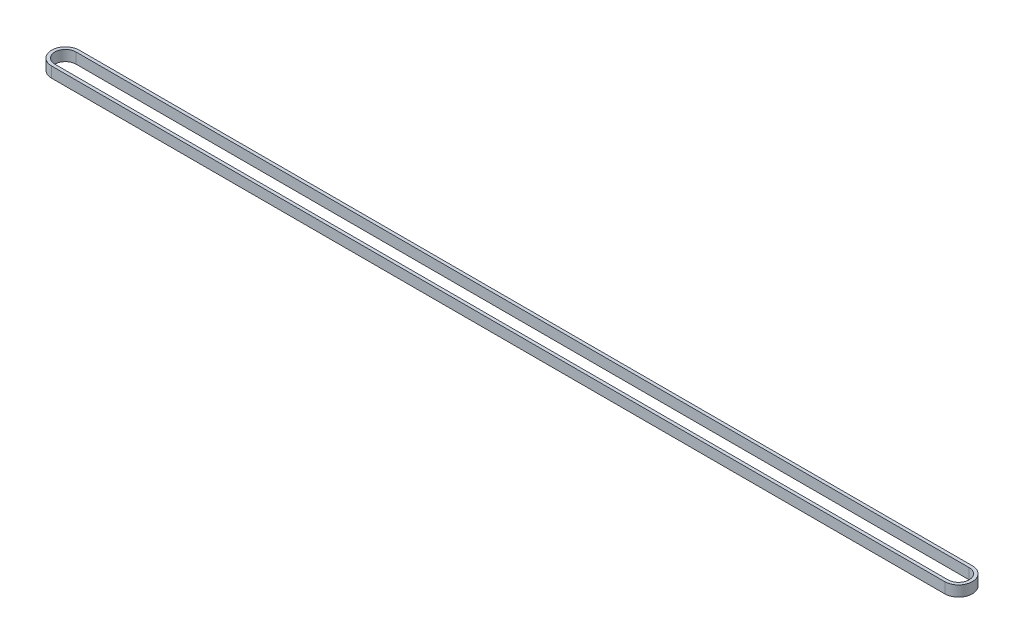
ISO-10303-21;
HEADER;
FILE_DESCRIPTION(('STEP AP214'),'2;1');
FILE_NAME('part.step','',(''),(''),'','','');
FILE_SCHEMA(('AUTOMOTIVE_DESIGN { 1 0 10303 214 1 1 1 1 }'));
ENDSEC;
DATA;
#1=APPLICATION_CONTEXT('core data for automotive mechanical design processes');
#2=APPLICATION_PROTOCOL_DEFINITION('international standard','automotive_design',2000,#1);
#3=PRODUCT_CONTEXT('',#1,'mechanical');
#4=PRODUCT('Part','Part','',(#3));
#5=PRODUCT_RELATED_PRODUCT_CATEGORY('part','',(#4));
#6=PRODUCT_DEFINITION_FORMATION('','',#4);
#7=PRODUCT_DEFINITION_CONTEXT('part definition',#1,'design');
#8=PRODUCT_DEFINITION('design','',#6,#7);
#9=PRODUCT_DEFINITION_SHAPE('','',#8);
#10=(LENGTH_UNIT() NAMED_UNIT(*) SI_UNIT(.MILLI.,.METRE.));
#11=(NAMED_UNIT(*) PLANE_ANGLE_UNIT() SI_UNIT($,.RADIAN.));
#12=(NAMED_UNIT(*) SI_UNIT($,.STERADIAN.) SOLID_ANGLE_UNIT());
#13=UNCERTAINTY_MEASURE_WITH_UNIT(LENGTH_MEASURE(1.E-05),#10,'distance_accuracy_value','');
#14=(GEOMETRIC_REPRESENTATION_CONTEXT(3) GLOBAL_UNCERTAINTY_ASSIGNED_CONTEXT((#13)) GLOBAL_UNIT_ASSIGNED_CONTEXT((#10,
#11,#12)) REPRESENTATION_CONTEXT('',''));
#15=CARTESIAN_POINT('',(0.,0.,0.));
#16=DIRECTION('',(0.,0.,1.));
#17=DIRECTION('',(1.,0.,0.));
#18=AXIS2_PLACEMENT_3D('',#15,#16,#17);
#19=CARTESIAN_POINT('',(0.,6.,0.));
#20=DIRECTION('',(0.,1.,0.));
#21=DIRECTION('',(0.,0.,1.));
#22=AXIS2_PLACEMENT_3D('',#19,#20,#21);
#23=PLANE('',#22);
#24=CARTESIAN_POINT('',(0.,6.,0.));
#25=DIRECTION('',(0.,1.,0.));
#26=DIRECTION('',(0.,0.,1.));
#27=AXIS2_PLACEMENT_3D('',#24,#25,#26);
#28=CIRCLE('',#27,7.8);
#29=CARTESIAN_POINT('',(0.,6.,-7.8));
#30=VERTEX_POINT('',#29);
#31=CARTESIAN_POINT('',(0.,6.,7.8));
#32=VERTEX_POINT('',#31);
#33=EDGE_CURVE('E138',#30,#32,#28,.T.);
#34=ORIENTED_EDGE('',*,*,#33,.T.);
#35=DIRECTION('',(1.,0.,0.));
#36=VECTOR('',#35,1.);
#37=CARTESIAN_POINT('',(0.,6.,7.8));
#38=LINE('',#37,#36);
#39=CARTESIAN_POINT('',(505.5,6.,7.8));
#40=VERTEX_POINT('',#39);
#41=EDGE_CURVE('E141',#32,#40,#38,.T.);
#42=ORIENTED_EDGE('',*,*,#41,.T.);
#43=CARTESIAN_POINT('',(505.5,6.,0.));
#44=DIRECTION('',(0.,1.,0.));
#45=DIRECTION('',(0.,0.,1.));
#46=AXIS2_PLACEMENT_3D('',#43,#44,#45);
#47=CIRCLE('',#46,7.8);
#48=CARTESIAN_POINT('',(505.5,6.,-7.8));
#49=VERTEX_POINT('',#48);
#50=EDGE_CURVE('E144',#40,#49,#47,.T.);
#51=ORIENTED_EDGE('',*,*,#50,.T.);
#52=DIRECTION('',(-1.,0.,0.));
#53=VECTOR('',#52,1.);
#54=CARTESIAN_POINT('',(0.,6.,-7.8));
#55=LINE('',#54,#53);
#56=EDGE_CURVE('E146',#49,#30,#55,.T.);
#57=ORIENTED_EDGE('',*,*,#56,.T.);
#58=EDGE_LOOP('',(#34,#42,#51,#57));
#59=FACE_BOUND('',#58,.T.);
#60=DIRECTION('',(1.,0.,0.));
#61=VECTOR('',#60,1.);
#62=CARTESIAN_POINT('',(0.,6.,6.));
#63=LINE('',#62,#61);
#64=CARTESIAN_POINT('',(0.,6.,6.));
#65=VERTEX_POINT('',#64);
#66=CARTESIAN_POINT('',(505.5,6.,6.));
#67=VERTEX_POINT('',#66);
#68=EDGE_CURVE('E110',#65,#67,#63,.T.);
#69=ORIENTED_EDGE('',*,*,#68,.F.);
#70=CARTESIAN_POINT('',(0.,6.,0.));
#71=DIRECTION('',(0.,1.,0.));
#72=DIRECTION('',(0.,0.,1.));
#73=AXIS2_PLACEMENT_3D('',#70,#71,#72);
#74=CIRCLE('',#73,6.);
#75=CARTESIAN_POINT('',(0.,6.,-6.));
#76=VERTEX_POINT('',#75);
#77=EDGE_CURVE('E102',#76,#65,#74,.T.);
#78=ORIENTED_EDGE('',*,*,#77,.F.);
#79=DIRECTION('',(-1.,0.,0.));
#80=VECTOR('',#79,1.);
#81=CARTESIAN_POINT('',(0.,6.,-6.));
#82=LINE('',#81,#80);
#83=CARTESIAN_POINT('',(505.5,6.,-6.));
#84=VERTEX_POINT('',#83);
#85=EDGE_CURVE('E124',#84,#76,#82,.T.);
#86=ORIENTED_EDGE('',*,*,#85,.F.);
#87=CARTESIAN_POINT('',(505.5,6.,0.));
#88=DIRECTION('',(0.,1.,0.));
#89=DIRECTION('',(0.,0.,1.));
#90=AXIS2_PLACEMENT_3D('',#87,#88,#89);
#91=CIRCLE('',#90,6.);
#92=EDGE_CURVE('E122',#67,#84,#91,.T.);
#93=ORIENTED_EDGE('',*,*,#92,.F.);
#94=EDGE_LOOP('',(#69,#78,#86,#93));
#95=FACE_BOUND('',#94,.T.);
#96=ADVANCED_FACE('F37',(#59,#95),#23,.T.);
#97=CARTESIAN_POINT('',(0.,0.,0.));
#98=DIRECTION('',(0.,1.,0.));
#99=DIRECTION('',(0.,0.,1.));
#100=AXIS2_PLACEMENT_3D('',#97,#98,#99);
#101=PLANE('',#100);
#102=CARTESIAN_POINT('',(0.,0.,0.));
#103=DIRECTION('',(0.,1.,0.));
#104=DIRECTION('',(0.,0.,1.));
#105=AXIS2_PLACEMENT_3D('',#102,#103,#104);
#106=CIRCLE('',#105,7.8);
#107=CARTESIAN_POINT('',(0.,0.,-7.8));
#108=VERTEX_POINT('',#107);
#109=CARTESIAN_POINT('',(0.,0.,7.8));
#110=VERTEX_POINT('',#109);
#111=EDGE_CURVE('E118',#108,#110,#106,.T.);
#112=ORIENTED_EDGE('',*,*,#111,.F.);
#113=DIRECTION('',(-1.,0.,0.));
#114=VECTOR('',#113,1.);
#115=CARTESIAN_POINT('',(0.,0.,-7.8));
#116=LINE('',#115,#114);
#117=CARTESIAN_POINT('',(505.5,0.,-7.8));
#118=VERTEX_POINT('',#117);
#119=EDGE_CURVE('E142',#118,#108,#116,.T.);
#120=ORIENTED_EDGE('',*,*,#119,.F.);
#121=CARTESIAN_POINT('',(505.5,0.,0.));
#122=DIRECTION('',(0.,1.,0.));
#123=DIRECTION('',(0.,0.,1.));
#124=AXIS2_PLACEMENT_3D('',#121,#122,#123);
#125=CIRCLE('',#124,7.8);
#126=CARTESIAN_POINT('',(505.5,0.,7.8));
#127=VERTEX_POINT('',#126);
#128=EDGE_CURVE('E153',#127,#118,#125,.T.);
#129=ORIENTED_EDGE('',*,*,#128,.F.);
#130=DIRECTION('',(1.,0.,0.));
#131=VECTOR('',#130,1.);
#132=CARTESIAN_POINT('',(0.,0.,7.8));
#133=LINE('',#132,#131);
#134=EDGE_CURVE('E151',#110,#127,#133,.T.);
#135=ORIENTED_EDGE('',*,*,#134,.F.);
#136=EDGE_LOOP('',(#112,#120,#129,#135));
#137=FACE_BOUND('',#136,.T.);
#138=CARTESIAN_POINT('',(0.,0.,0.));
#139=DIRECTION('',(0.,1.,0.));
#140=DIRECTION('',(0.,0.,1.));
#141=AXIS2_PLACEMENT_3D('',#138,#139,#140);
#142=CIRCLE('',#141,6.);
#143=CARTESIAN_POINT('',(0.,0.,-6.));
#144=VERTEX_POINT('',#143);
#145=CARTESIAN_POINT('',(0.,0.,6.));
#146=VERTEX_POINT('',#145);
#147=EDGE_CURVE('E60',#144,#146,#142,.T.);
#148=ORIENTED_EDGE('',*,*,#147,.T.);
#149=DIRECTION('',(1.,0.,0.));
#150=VECTOR('',#149,1.);
#151=CARTESIAN_POINT('',(0.,0.,6.));
#152=LINE('',#151,#150);
#153=CARTESIAN_POINT('',(505.5,0.,6.));
#154=VERTEX_POINT('',#153);
#155=EDGE_CURVE('E117',#146,#154,#152,.T.);
#156=ORIENTED_EDGE('',*,*,#155,.T.);
#157=CARTESIAN_POINT('',(505.5,0.,0.));
#158=DIRECTION('',(0.,1.,0.));
#159=DIRECTION('',(0.,0.,1.));
#160=AXIS2_PLACEMENT_3D('',#157,#158,#159);
#161=CIRCLE('',#160,6.);
#162=CARTESIAN_POINT('',(505.5,0.,-6.));
#163=VERTEX_POINT('',#162);
#164=EDGE_CURVE('E130',#154,#163,#161,.T.);
#165=ORIENTED_EDGE('',*,*,#164,.T.);
#166=DIRECTION('',(-1.,0.,0.));
#167=VECTOR('',#166,1.);
#168=CARTESIAN_POINT('',(0.,0.,-6.));
#169=LINE('',#168,#167);
#170=EDGE_CURVE('E111',#163,#144,#169,.T.);
#171=ORIENTED_EDGE('',*,*,#170,.T.);
#172=EDGE_LOOP('',(#148,#156,#165,#171));
#173=FACE_BOUND('',#172,.T.);
#174=ADVANCED_FACE('F171',(#137,#173),#101,.F.);
#175=CARTESIAN_POINT('',(0.,6.,0.));
#176=DIRECTION('',(0.,-1.,0.));
#177=DIRECTION('',(0.,0.,-1.));
#178=AXIS2_PLACEMENT_3D('',#175,#176,#177);
#179=CYLINDRICAL_SURFACE('',#178,7.8);
#180=ORIENTED_EDGE('',*,*,#111,.T.);
#181=DIRECTION('',(0.,-1.,0.));
#182=VECTOR('',#181,1.);
#183=CARTESIAN_POINT('',(0.,6.,7.8));
#184=LINE('',#183,#182);
#185=EDGE_CURVE('E11',#32,#110,#184,.T.);
#186=ORIENTED_EDGE('',*,*,#185,.F.);
#187=ORIENTED_EDGE('',*,*,#33,.F.);
#188=DIRECTION('',(0.,-1.,0.));
#189=VECTOR('',#188,1.);
#190=CARTESIAN_POINT('',(0.,6.,-7.8));
#191=LINE('',#190,#189);
#192=EDGE_CURVE('E148',#30,#108,#191,.T.);
#193=ORIENTED_EDGE('',*,*,#192,.T.);
#194=EDGE_LOOP('',(#180,#186,#187,#193));
#195=FACE_BOUND('',#194,.T.);
#196=ADVANCED_FACE('F39',(#195),#179,.T.);
#197=CARTESIAN_POINT('',(0.,6.,7.8));
#198=DIRECTION('',(0.,0.,-1.));
#199=DIRECTION('',(-1.,0.,0.));
#200=AXIS2_PLACEMENT_3D('',#197,#198,#199);
#201=PLANE('',#200);
#202=ORIENTED_EDGE('',*,*,#134,.T.);
#203=DIRECTION('',(0.,-1.,0.));
#204=VECTOR('',#203,1.);
#205=CARTESIAN_POINT('',(505.5,6.,7.8));
#206=LINE('',#205,#204);
#207=EDGE_CURVE('E45',#40,#127,#206,.T.);
#208=ORIENTED_EDGE('',*,*,#207,.F.);
#209=ORIENTED_EDGE('',*,*,#41,.F.);
#210=ORIENTED_EDGE('',*,*,#185,.T.);
#211=EDGE_LOOP('',(#202,#208,#209,#210));
#212=FACE_BOUND('',#211,.T.);
#213=ADVANCED_FACE('F181',(#212),#201,.F.);
#214=CARTESIAN_POINT('',(505.5,6.,0.));
#215=DIRECTION('',(0.,-1.,0.));
#216=DIRECTION('',(0.,0.,-1.));
#217=AXIS2_PLACEMENT_3D('',#214,#215,#216);
#218=CYLINDRICAL_SURFACE('',#217,7.8);
#219=ORIENTED_EDGE('',*,*,#128,.T.);
#220=DIRECTION('',(0.,-1.,0.));
#221=VECTOR('',#220,1.);
#222=CARTESIAN_POINT('',(505.5,6.,-7.8));
#223=LINE('',#222,#221);
#224=EDGE_CURVE('E158',#49,#118,#223,.T.);
#225=ORIENTED_EDGE('',*,*,#224,.F.);
#226=ORIENTED_EDGE('',*,*,#50,.F.);
#227=ORIENTED_EDGE('',*,*,#207,.T.);
#228=EDGE_LOOP('',(#219,#225,#226,#227));
#229=FACE_BOUND('',#228,.T.);
#230=ADVANCED_FACE('F165',(#229),#218,.T.);
#231=CARTESIAN_POINT('',(0.,6.,-7.8));
#232=DIRECTION('',(0.,0.,1.));
#233=DIRECTION('',(1.,0.,0.));
#234=AXIS2_PLACEMENT_3D('',#231,#232,#233);
#235=PLANE('',#234);
#236=ORIENTED_EDGE('',*,*,#119,.T.);
#237=ORIENTED_EDGE('',*,*,#192,.F.);
#238=ORIENTED_EDGE('',*,*,#56,.F.);
#239=ORIENTED_EDGE('',*,*,#224,.T.);
#240=EDGE_LOOP('',(#236,#237,#238,#239));
#241=FACE_BOUND('',#240,.T.);
#242=ADVANCED_FACE('F175',(#241),#235,.F.);
#243=CARTESIAN_POINT('',(0.,6.,0.));
#244=DIRECTION('',(0.,-1.,0.));
#245=DIRECTION('',(0.,0.,-1.));
#246=AXIS2_PLACEMENT_3D('',#243,#244,#245);
#247=CYLINDRICAL_SURFACE('',#246,6.);
#248=ORIENTED_EDGE('',*,*,#147,.F.);
#249=DIRECTION('',(0.,-1.,0.));
#250=VECTOR('',#249,1.);
#251=CARTESIAN_POINT('',(0.,6.,-6.));
#252=LINE('',#251,#250);
#253=EDGE_CURVE('E106',#76,#144,#252,.T.);
#254=ORIENTED_EDGE('',*,*,#253,.F.);
#255=ORIENTED_EDGE('',*,*,#77,.T.);
#256=DIRECTION('',(0.,-1.,0.));
#257=VECTOR('',#256,1.);
#258=CARTESIAN_POINT('',(0.,6.,6.));
#259=LINE('',#258,#257);
#260=EDGE_CURVE('E105',#65,#146,#259,.T.);
#261=ORIENTED_EDGE('',*,*,#260,.T.);
#262=EDGE_LOOP('',(#248,#254,#255,#261));
#263=FACE_BOUND('',#262,.T.);
#264=ADVANCED_FACE('F104',(#263),#247,.F.);
#265=CARTESIAN_POINT('',(0.,6.,6.));
#266=DIRECTION('',(0.,0.,-1.));
#267=DIRECTION('',(-1.,0.,0.));
#268=AXIS2_PLACEMENT_3D('',#265,#266,#267);
#269=PLANE('',#268);
#270=ORIENTED_EDGE('',*,*,#155,.F.);
#271=ORIENTED_EDGE('',*,*,#260,.F.);
#272=ORIENTED_EDGE('',*,*,#68,.T.);
#273=DIRECTION('',(0.,-1.,0.));
#274=VECTOR('',#273,1.);
#275=CARTESIAN_POINT('',(505.5,6.,6.));
#276=LINE('',#275,#274);
#277=EDGE_CURVE('E119',#67,#154,#276,.T.);
#278=ORIENTED_EDGE('',*,*,#277,.T.);
#279=EDGE_LOOP('',(#270,#271,#272,#278));
#280=FACE_BOUND('',#279,.T.);
#281=ADVANCED_FACE('F114',(#280),#269,.T.);
#282=CARTESIAN_POINT('',(505.5,6.,0.));
#283=DIRECTION('',(0.,-1.,0.));
#284=DIRECTION('',(0.,0.,-1.));
#285=AXIS2_PLACEMENT_3D('',#282,#283,#284);
#286=CYLINDRICAL_SURFACE('',#285,6.);
#287=ORIENTED_EDGE('',*,*,#164,.F.);
#288=ORIENTED_EDGE('',*,*,#277,.F.);
#289=ORIENTED_EDGE('',*,*,#92,.T.);
#290=DIRECTION('',(0.,-1.,0.));
#291=VECTOR('',#290,1.);
#292=CARTESIAN_POINT('',(505.5,6.,-6.));
#293=LINE('',#292,#291);
#294=EDGE_CURVE('E52',#84,#163,#293,.T.);
#295=ORIENTED_EDGE('',*,*,#294,.T.);
#296=EDGE_LOOP('',(#287,#288,#289,#295));
#297=FACE_BOUND('',#296,.T.);
#298=ADVANCED_FACE('F204',(#297),#286,.F.);
#299=CARTESIAN_POINT('',(0.,6.,-6.));
#300=DIRECTION('',(0.,0.,1.));
#301=DIRECTION('',(1.,0.,0.));
#302=AXIS2_PLACEMENT_3D('',#299,#300,#301);
#303=PLANE('',#302);
#304=ORIENTED_EDGE('',*,*,#170,.F.);
#305=ORIENTED_EDGE('',*,*,#294,.F.);
#306=ORIENTED_EDGE('',*,*,#85,.T.);
#307=ORIENTED_EDGE('',*,*,#253,.T.);
#308=EDGE_LOOP('',(#304,#305,#306,#307));
#309=FACE_BOUND('',#308,.T.);
#310=ADVANCED_FACE('F208',(#309),#303,.T.);
#311=CLOSED_SHELL('',(#96,#174,#196,#213,#230,#242,#264,#281,#298,#310));
#312=MANIFOLD_SOLID_BREP('B2',#311);
#313=ADVANCED_BREP_SHAPE_REPRESENTATION('',(#18,#312),#14);
#314=SHAPE_DEFINITION_REPRESENTATION(#9,#313);
ENDSEC;
END-ISO-10303-21;
